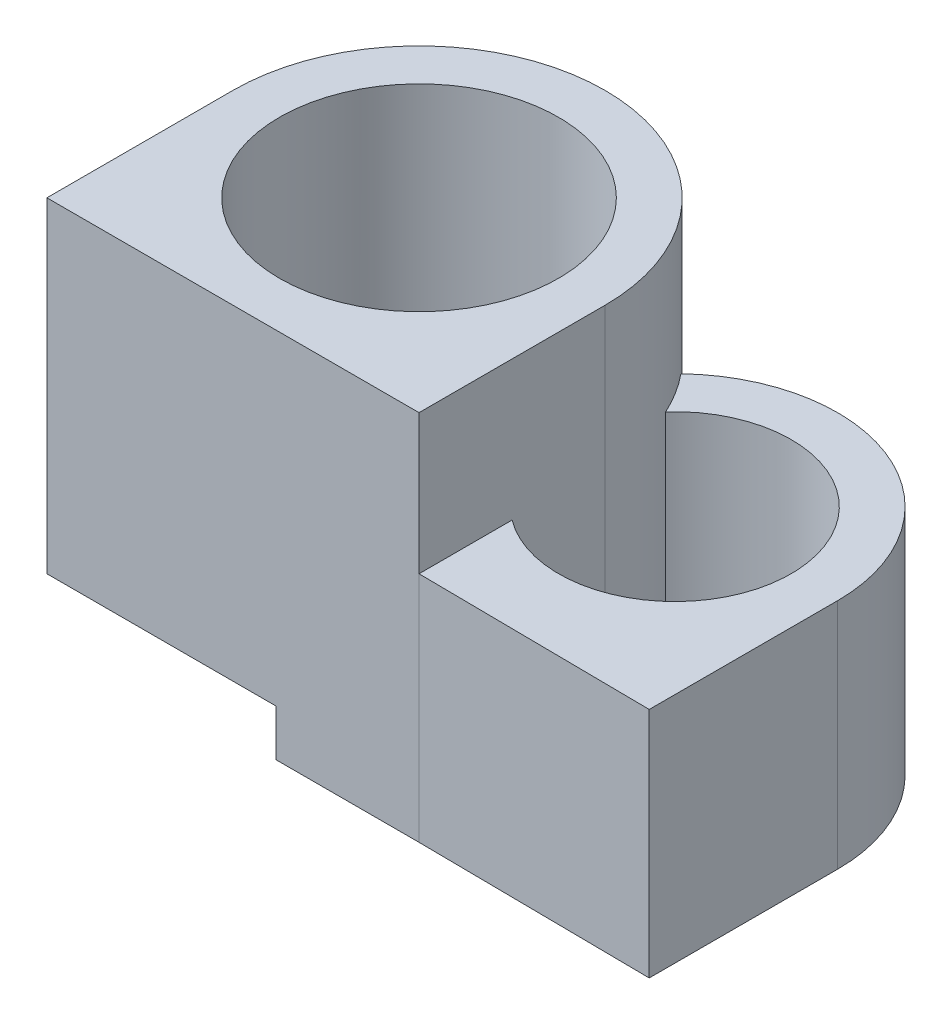
ISO-10303-21;
HEADER;
FILE_DESCRIPTION(('STEP AP214'),'2;1');
FILE_NAME('part.step','',(''),(''),'','','');
FILE_SCHEMA(('AUTOMOTIVE_DESIGN { 1 0 10303 214 1 1 1 1 }'));
ENDSEC;
DATA;
#1=APPLICATION_CONTEXT('core data for automotive mechanical design processes');
#2=APPLICATION_PROTOCOL_DEFINITION('international standard','automotive_design',2000,#1);
#3=PRODUCT_CONTEXT('',#1,'mechanical');
#4=PRODUCT('Part','Part','',(#3));
#5=PRODUCT_RELATED_PRODUCT_CATEGORY('part','',(#4));
#6=PRODUCT_DEFINITION_FORMATION('','',#4);
#7=PRODUCT_DEFINITION_CONTEXT('part definition',#1,'design');
#8=PRODUCT_DEFINITION('design','',#6,#7);
#9=PRODUCT_DEFINITION_SHAPE('','',#8);
#10=(LENGTH_UNIT() NAMED_UNIT(*) SI_UNIT(.MILLI.,.METRE.));
#11=(NAMED_UNIT(*) PLANE_ANGLE_UNIT() SI_UNIT($,.RADIAN.));
#12=(NAMED_UNIT(*) SI_UNIT($,.STERADIAN.) SOLID_ANGLE_UNIT());
#13=UNCERTAINTY_MEASURE_WITH_UNIT(LENGTH_MEASURE(1.E-05),#10,'distance_accuracy_value','');
#14=(GEOMETRIC_REPRESENTATION_CONTEXT(3) GLOBAL_UNCERTAINTY_ASSIGNED_CONTEXT((#13)) GLOBAL_UNIT_ASSIGNED_CONTEXT((#10,
#11,#12)) REPRESENTATION_CONTEXT('',''));
#15=CARTESIAN_POINT('',(0.,0.,0.));
#16=DIRECTION('',(0.,0.,1.));
#17=DIRECTION('',(1.,0.,0.));
#18=AXIS2_PLACEMENT_3D('',#15,#16,#17);
#19=CARTESIAN_POINT('',(0.,0.,0.));
#20=DIRECTION('',(0.,1.,0.));
#21=DIRECTION('',(0.,0.,1.));
#22=AXIS2_PLACEMENT_3D('',#19,#20,#21);
#23=PLANE('',#22);
#24=CARTESIAN_POINT('',(5.5,0.,0.));
#25=DIRECTION('',(0.,1.,0.));
#26=DIRECTION('',(0.,0.,1.));
#27=AXIS2_PLACEMENT_3D('',#24,#25,#26);
#28=CIRCLE('',#27,2.5);
#29=CARTESIAN_POINT('',(3.63636363636364,0.,-1.66639116180212));
#30=VERTEX_POINT('',#29);
#31=CARTESIAN_POINT('',(3.20908262871858,0.,-1.00084843905609));
#32=VERTEX_POINT('',#31);
#33=EDGE_CURVE('E203',#30,#32,#28,.T.);
#34=ORIENTED_EDGE('',*,*,#33,.F.);
#35=CARTESIAN_POINT('',(0.,0.,0.));
#36=DIRECTION('',(0.,1.,0.));
#37=DIRECTION('',(0.,0.,1.));
#38=AXIS2_PLACEMENT_3D('',#35,#36,#37);
#39=CIRCLE('',#38,4.);
#40=CARTESIAN_POINT('',(4.,0.,0.));
#41=VERTEX_POINT('',#40);
#42=EDGE_CURVE('E252',#41,#30,#39,.T.);
#43=ORIENTED_EDGE('',*,*,#42,.F.);
#44=DIRECTION('',(-0.620017940558597,0.,-0.7845876326998));
#45=VECTOR('',#44,1.);
#46=CARTESIAN_POINT('',(2.4623110135419,0.,-1.9458336328571));
#47=LINE('',#46,#45);
#48=EDGE_CURVE('E220',#41,#32,#47,.T.);
#49=ORIENTED_EDGE('',*,*,#48,.T.);
#50=EDGE_LOOP('',(#34,#43,#49));
#51=FACE_BOUND('',#50,.T.);
#52=ADVANCED_FACE('F39',(#51),#23,.F.);
#53=CARTESIAN_POINT('',(4.,7.,0.));
#54=DIRECTION('',(-1.,0.,0.));
#55=DIRECTION('',(0.,0.,1.));
#56=AXIS2_PLACEMENT_3D('',#53,#54,#55);
#57=PLANE('',#56);
#58=DIRECTION('',(0.,-1.,0.));
#59=VECTOR('',#58,1.);
#60=CARTESIAN_POINT('',(4.,4.,2.));
#61=LINE('',#60,#59);
#62=CARTESIAN_POINT('',(4.,4.,2.));
#63=VERTEX_POINT('',#62);
#64=CARTESIAN_POINT('',(4.,-1.,2.));
#65=VERTEX_POINT('',#64);
#66=EDGE_CURVE('E190',#63,#65,#61,.T.);
#67=ORIENTED_EDGE('',*,*,#66,.T.);
#68=DIRECTION('',(0.,0.,1.));
#69=VECTOR('',#68,1.);
#70=CARTESIAN_POINT('',(4.,-1.,0.));
#71=LINE('',#70,#69);
#72=CARTESIAN_POINT('',(4.,-1.,0.));
#73=VERTEX_POINT('',#72);
#74=EDGE_CURVE('E209',#73,#65,#71,.T.);
#75=ORIENTED_EDGE('',*,*,#74,.F.);
#76=DIRECTION('',(0.,1.,0.));
#77=VECTOR('',#76,1.);
#78=CARTESIAN_POINT('',(4.,-1.,0.));
#79=LINE('',#78,#77);
#80=EDGE_CURVE('E239',#73,#41,#79,.T.);
#81=ORIENTED_EDGE('',*,*,#80,.T.);
#82=DIRECTION('',(0.,-1.,0.));
#83=VECTOR('',#82,1.);
#84=CARTESIAN_POINT('',(4.,7.,0.));
#85=LINE('',#84,#83);
#86=CARTESIAN_POINT('',(4.,7.,0.));
#87=VERTEX_POINT('',#86);
#88=EDGE_CURVE('E269',#87,#41,#85,.T.);
#89=ORIENTED_EDGE('',*,*,#88,.F.);
#90=DIRECTION('',(0.,0.,-1.));
#91=VECTOR('',#90,1.);
#92=CARTESIAN_POINT('',(4.,7.,0.));
#93=LINE('',#92,#91);
#94=CARTESIAN_POINT('',(4.,7.,4.));
#95=VERTEX_POINT('',#94);
#96=EDGE_CURVE('E254',#95,#87,#93,.T.);
#97=ORIENTED_EDGE('',*,*,#96,.F.);
#98=DIRECTION('',(0.,-1.,0.));
#99=VECTOR('',#98,1.);
#100=CARTESIAN_POINT('',(4.,7.,4.));
#101=LINE('',#100,#99);
#102=CARTESIAN_POINT('',(4.,4.,4.));
#103=VERTEX_POINT('',#102);
#104=EDGE_CURVE('E271',#95,#103,#101,.T.);
#105=ORIENTED_EDGE('',*,*,#104,.T.);
#106=DIRECTION('',(0.,0.,1.));
#107=VECTOR('',#106,1.);
#108=CARTESIAN_POINT('',(4.,4.,0.));
#109=LINE('',#108,#107);
#110=EDGE_CURVE('E175',#63,#103,#109,.T.);
#111=ORIENTED_EDGE('',*,*,#110,.F.);
#112=EDGE_LOOP('',(#67,#75,#81,#89,#97,#105,#111));
#113=FACE_BOUND('',#112,.T.);
#114=ADVANCED_FACE('F307',(#113),#57,.F.);
#115=CARTESIAN_POINT('',(0.,7.,0.));
#116=DIRECTION('',(0.,-1.,0.));
#117=DIRECTION('',(0.,0.,-1.));
#118=AXIS2_PLACEMENT_3D('',#115,#116,#117);
#119=CYLINDRICAL_SURFACE('',#118,4.);
#120=DIRECTION('',(0.,-1.,0.));
#121=VECTOR('',#120,1.);
#122=CARTESIAN_POINT('',(3.63636363636364,2.,-1.66639116180212));
#123=LINE('',#122,#121);
#124=CARTESIAN_POINT('',(3.63636363636364,4.,-1.66639116180212));
#125=VERTEX_POINT('',#124);
#126=EDGE_CURVE('E54',#125,#30,#123,.T.);
#127=ORIENTED_EDGE('',*,*,#126,.F.);
#128=CARTESIAN_POINT('',(0.,4.,0.));
#129=DIRECTION('',(0.,-1.,0.));
#130=DIRECTION('',(0.,0.,-1.));
#131=AXIS2_PLACEMENT_3D('',#128,#129,#130);
#132=CIRCLE('',#131,4.);
#133=CARTESIAN_POINT('',(3.09090909090909,4.,-2.53895273523072));
#134=VERTEX_POINT('',#133);
#135=EDGE_CURVE('E11',#134,#125,#132,.T.);
#136=ORIENTED_EDGE('',*,*,#135,.F.);
#137=DIRECTION('',(0.,-1.,0.));
#138=VECTOR('',#137,1.);
#139=CARTESIAN_POINT('',(3.09090909090909,1.5,-2.53895273523072));
#140=LINE('',#139,#138);
#141=CARTESIAN_POINT('',(3.09090909090909,0.,-2.53895273523072));
#142=VERTEX_POINT('',#141);
#143=EDGE_CURVE('E155',#134,#142,#140,.T.);
#144=ORIENTED_EDGE('',*,*,#143,.T.);
#145=CARTESIAN_POINT('',(0.924622027083809,0.,-3.8916672657142));
#146=VERTEX_POINT('',#145);
#147=EDGE_CURVE('E266',#142,#146,#39,.T.);
#148=ORIENTED_EDGE('',*,*,#147,.T.);
#149=CARTESIAN_POINT('',(-4.,0.,0.));
#150=VERTEX_POINT('',#149);
#151=EDGE_CURVE('E264',#146,#150,#39,.T.);
#152=ORIENTED_EDGE('',*,*,#151,.T.);
#153=DIRECTION('',(0.,-1.,0.));
#154=VECTOR('',#153,1.);
#155=CARTESIAN_POINT('',(-4.,7.,0.));
#156=LINE('',#155,#154);
#157=CARTESIAN_POINT('',(-4.,7.,0.));
#158=VERTEX_POINT('',#157);
#159=EDGE_CURVE('E258',#158,#150,#156,.T.);
#160=ORIENTED_EDGE('',*,*,#159,.F.);
#161=CARTESIAN_POINT('',(0.,7.,0.));
#162=DIRECTION('',(0.,1.,0.));
#163=DIRECTION('',(0.,0.,1.));
#164=AXIS2_PLACEMENT_3D('',#161,#162,#163);
#165=CIRCLE('',#164,4.);
#166=EDGE_CURVE('E256',#87,#158,#165,.T.);
#167=ORIENTED_EDGE('',*,*,#166,.F.);
#168=ORIENTED_EDGE('',*,*,#88,.T.);
#169=ORIENTED_EDGE('',*,*,#42,.T.);
#170=EDGE_LOOP('',(#127,#136,#144,#148,#152,#160,#167,#168,#169));
#171=FACE_BOUND('',#170,.T.);
#172=ADVANCED_FACE('F313',(#171),#119,.T.);
#173=CARTESIAN_POINT('',(2.4623110135419,-1.,-1.9458336328571));
#174=DIRECTION('',(0.7845876326998,0.,-0.620017940558597));
#175=DIRECTION('',(-0.620017940558597,0.,-0.7845876326998));
#176=AXIS2_PLACEMENT_3D('',#173,#174,#175);
#177=PLANE('',#176);
#178=DIRECTION('',(-0.620017940558597,0.,-0.7845876326998));
#179=VECTOR('',#178,1.);
#180=CARTESIAN_POINT('',(2.4623110135419,-1.,-1.9458336328571));
#181=LINE('',#180,#179);
#182=CARTESIAN_POINT('',(3.20908262871858,-1.,-1.00084843905609));
#183=VERTEX_POINT('',#182);
#184=EDGE_CURVE('E207',#73,#183,#181,.T.);
#185=ORIENTED_EDGE('',*,*,#184,.T.);
#186=DIRECTION('',(0.,-1.,0.));
#187=VECTOR('',#186,1.);
#188=CARTESIAN_POINT('',(3.20908262871858,4.,-1.00084843905609));
#189=LINE('',#188,#187);
#190=EDGE_CURVE('E187',#32,#183,#189,.T.);
#191=ORIENTED_EDGE('',*,*,#190,.F.);
#192=ORIENTED_EDGE('',*,*,#48,.F.);
#193=ORIENTED_EDGE('',*,*,#80,.F.);
#194=EDGE_LOOP('',(#185,#191,#192,#193));
#195=FACE_BOUND('',#194,.T.);
#196=ADVANCED_FACE('F345',(#195),#177,.T.);
#197=DIRECTION('',(0.,0.,-1.));
#198=VECTOR('',#197,1.);
#199=CARTESIAN_POINT('',(0.924622027083809,0.,0.));
#200=LINE('',#199,#198);
#201=CARTESIAN_POINT('',(0.924622027083809,0.,-2.8539576218002));
#202=VERTEX_POINT('',#201);
#203=EDGE_CURVE('E226',#202,#146,#200,.T.);
#204=ORIENTED_EDGE('',*,*,#203,.F.);
#205=CARTESIAN_POINT('',(0.,0.,0.));
#206=DIRECTION('',(0.,1.,0.));
#207=DIRECTION('',(0.,0.,1.));
#208=AXIS2_PLACEMENT_3D('',#205,#206,#207);
#209=CIRCLE('',#208,3.);
#210=CARTESIAN_POINT('',(0.924622027083809,0.,2.8539576218002));
#211=VERTEX_POINT('',#210);
#212=EDGE_CURVE('E242',#202,#211,#209,.T.);
#213=ORIENTED_EDGE('',*,*,#212,.T.);
#214=CARTESIAN_POINT('',(0.924622027083809,0.,4.));
#215=VERTEX_POINT('',#214);
#216=EDGE_CURVE('E223',#215,#211,#200,.T.);
#217=ORIENTED_EDGE('',*,*,#216,.F.);
#218=DIRECTION('',(1.,0.,0.));
#219=VECTOR('',#218,1.);
#220=CARTESIAN_POINT('',(4.,0.,4.));
#221=LINE('',#220,#219);
#222=CARTESIAN_POINT('',(-4.,0.,4.));
#223=VERTEX_POINT('',#222);
#224=EDGE_CURVE('E261',#223,#215,#221,.T.);
#225=ORIENTED_EDGE('',*,*,#224,.F.);
#226=DIRECTION('',(0.,0.,1.));
#227=VECTOR('',#226,1.);
#228=CARTESIAN_POINT('',(-4.,0.,4.));
#229=LINE('',#228,#227);
#230=EDGE_CURVE('E246',#150,#223,#229,.T.);
#231=ORIENTED_EDGE('',*,*,#230,.F.);
#232=ORIENTED_EDGE('',*,*,#151,.F.);
#233=EDGE_LOOP('',(#204,#213,#217,#225,#231,#232));
#234=FACE_BOUND('',#233,.T.);
#235=ADVANCED_FACE('F285',(#234),#23,.F.);
#236=CARTESIAN_POINT('',(0.,7.,0.));
#237=DIRECTION('',(0.,1.,0.));
#238=DIRECTION('',(0.,0.,1.));
#239=AXIS2_PLACEMENT_3D('',#236,#237,#238);
#240=PLANE('',#239);
#241=DIRECTION('',(0.,0.,1.));
#242=VECTOR('',#241,1.);
#243=CARTESIAN_POINT('',(-4.,7.,4.));
#244=LINE('',#243,#242);
#245=CARTESIAN_POINT('',(-4.,7.,4.));
#246=VERTEX_POINT('',#245);
#247=EDGE_CURVE('E248',#158,#246,#244,.T.);
#248=ORIENTED_EDGE('',*,*,#247,.T.);
#249=DIRECTION('',(1.,0.,0.));
#250=VECTOR('',#249,1.);
#251=CARTESIAN_POINT('',(4.,7.,4.));
#252=LINE('',#251,#250);
#253=EDGE_CURVE('E251',#246,#95,#252,.T.);
#254=ORIENTED_EDGE('',*,*,#253,.T.);
#255=ORIENTED_EDGE('',*,*,#96,.T.);
#256=ORIENTED_EDGE('',*,*,#166,.T.);
#257=EDGE_LOOP('',(#248,#254,#255,#256));
#258=FACE_BOUND('',#257,.T.);
#259=CARTESIAN_POINT('',(0.,7.,0.));
#260=DIRECTION('',(0.,1.,0.));
#261=DIRECTION('',(0.,0.,1.));
#262=AXIS2_PLACEMENT_3D('',#259,#260,#261);
#263=CIRCLE('',#262,3.);
#264=CARTESIAN_POINT('',(0.,7.,3.));
#265=VERTEX_POINT('',#264);
#266=EDGE_CURVE('E243',#265,#265,#263,.T.);
#267=ORIENTED_EDGE('',*,*,#266,.F.);
#268=EDGE_LOOP('',(#267));
#269=FACE_BOUND('',#268,.T.);
#270=ADVANCED_FACE('F311',(#258,#269),#240,.T.);
#271=ORIENTED_EDGE('',*,*,#147,.F.);
#272=CARTESIAN_POINT('',(5.5,0.,0.));
#273=DIRECTION('',(0.,1.,0.));
#274=DIRECTION('',(0.,0.,1.));
#275=AXIS2_PLACEMENT_3D('',#272,#273,#274);
#276=CIRCLE('',#275,3.5);
#277=CARTESIAN_POINT('',(2.53292876566691,0.,-1.85647200097203));
#278=VERTEX_POINT('',#277);
#279=EDGE_CURVE('E200',#142,#278,#276,.T.);
#280=ORIENTED_EDGE('',*,*,#279,.T.);
#281=EDGE_CURVE('E206',#278,#146,#47,.T.);
#282=ORIENTED_EDGE('',*,*,#281,.T.);
#283=EDGE_LOOP('',(#271,#280,#282));
#284=FACE_BOUND('',#283,.T.);
#285=ADVANCED_FACE('F318',(#284),#23,.F.);
#286=CARTESIAN_POINT('',(-4.,7.,4.));
#287=DIRECTION('',(1.,0.,0.));
#288=DIRECTION('',(0.,0.,-1.));
#289=AXIS2_PLACEMENT_3D('',#286,#287,#288);
#290=PLANE('',#289);
#291=ORIENTED_EDGE('',*,*,#230,.T.);
#292=DIRECTION('',(0.,-1.,0.));
#293=VECTOR('',#292,1.);
#294=CARTESIAN_POINT('',(-4.,7.,4.));
#295=LINE('',#294,#293);
#296=EDGE_CURVE('E47',#246,#223,#295,.T.);
#297=ORIENTED_EDGE('',*,*,#296,.F.);
#298=ORIENTED_EDGE('',*,*,#247,.F.);
#299=ORIENTED_EDGE('',*,*,#159,.T.);
#300=EDGE_LOOP('',(#291,#297,#298,#299));
#301=FACE_BOUND('',#300,.T.);
#302=ADVANCED_FACE('F41',(#301),#290,.F.);
#303=CARTESIAN_POINT('',(4.,7.,4.));
#304=DIRECTION('',(0.,0.,-1.));
#305=DIRECTION('',(-1.,0.,0.));
#306=AXIS2_PLACEMENT_3D('',#303,#304,#305);
#307=PLANE('',#306);
#308=ORIENTED_EDGE('',*,*,#224,.T.);
#309=DIRECTION('',(0.,1.,0.));
#310=VECTOR('',#309,1.);
#311=CARTESIAN_POINT('',(0.924622027083809,-1.,4.));
#312=LINE('',#311,#310);
#313=CARTESIAN_POINT('',(0.924622027083809,-1.,4.));
#314=VERTEX_POINT('',#313);
#315=EDGE_CURVE('E236',#314,#215,#312,.T.);
#316=ORIENTED_EDGE('',*,*,#315,.F.);
#317=DIRECTION('',(-1.,0.,0.));
#318=VECTOR('',#317,1.);
#319=CARTESIAN_POINT('',(0.,-1.,4.));
#320=LINE('',#319,#318);
#321=CARTESIAN_POINT('',(4.,-1.,4.));
#322=VERTEX_POINT('',#321);
#323=EDGE_CURVE('E213',#322,#314,#320,.T.);
#324=ORIENTED_EDGE('',*,*,#323,.F.);
#325=DIRECTION('',(0.,-1.,0.));
#326=VECTOR('',#325,1.);
#327=CARTESIAN_POINT('',(4.,4.,4.));
#328=LINE('',#327,#326);
#329=EDGE_CURVE('E193',#103,#322,#328,.T.);
#330=ORIENTED_EDGE('',*,*,#329,.F.);
#331=ORIENTED_EDGE('',*,*,#104,.F.);
#332=ORIENTED_EDGE('',*,*,#253,.F.);
#333=ORIENTED_EDGE('',*,*,#296,.T.);
#334=EDGE_LOOP('',(#308,#316,#324,#330,#331,#332,#333));
#335=FACE_BOUND('',#334,.T.);
#336=ADVANCED_FACE('F276',(#335),#307,.F.);
#337=CARTESIAN_POINT('',(0.,7.,0.));
#338=DIRECTION('',(0.,-1.,0.));
#339=DIRECTION('',(0.,0.,-1.));
#340=AXIS2_PLACEMENT_3D('',#337,#338,#339);
#341=CYLINDRICAL_SURFACE('',#340,3.);
#342=ORIENTED_EDGE('',*,*,#266,.T.);
#343=EDGE_LOOP('',(#342));
#344=FACE_BOUND('',#343,.T.);
#345=ORIENTED_EDGE('',*,*,#212,.F.);
#346=DIRECTION('',(0.,1.,0.));
#347=VECTOR('',#346,1.);
#348=CARTESIAN_POINT('',(0.924622027083809,-1.,-2.8539576218002));
#349=LINE('',#348,#347);
#350=CARTESIAN_POINT('',(0.924622027083809,-1.,-2.8539576218002));
#351=VERTEX_POINT('',#350);
#352=EDGE_CURVE('E230',#351,#202,#349,.T.);
#353=ORIENTED_EDGE('',*,*,#352,.F.);
#354=CARTESIAN_POINT('',(0.,-1.,0.));
#355=DIRECTION('',(0.,-1.,0.));
#356=DIRECTION('',(0.,0.,-1.));
#357=AXIS2_PLACEMENT_3D('',#354,#355,#356);
#358=CIRCLE('',#357,3.);
#359=CARTESIAN_POINT('',(0.924622027083809,-1.,2.8539576218002));
#360=VERTEX_POINT('',#359);
#361=EDGE_CURVE('E217',#360,#351,#358,.F.);
#362=ORIENTED_EDGE('',*,*,#361,.F.);
#363=DIRECTION('',(0.,1.,0.));
#364=VECTOR('',#363,1.);
#365=CARTESIAN_POINT('',(0.924622027083809,-1.,2.8539576218002));
#366=LINE('',#365,#364);
#367=EDGE_CURVE('E233',#360,#211,#366,.T.);
#368=ORIENTED_EDGE('',*,*,#367,.T.);
#369=EDGE_LOOP('',(#345,#353,#362,#368));
#370=FACE_BOUND('',#369,.T.);
#371=ADVANCED_FACE('F293',(#344,#370),#341,.F.);
#372=DIRECTION('',(0.,-1.,0.));
#373=VECTOR('',#372,1.);
#374=CARTESIAN_POINT('',(2.53292876566691,4.,-1.85647200097203));
#375=LINE('',#374,#373);
#376=CARTESIAN_POINT('',(2.53292876566691,-1.,-1.85647200097203));
#377=VERTEX_POINT('',#376);
#378=EDGE_CURVE('E168',#278,#377,#375,.T.);
#379=ORIENTED_EDGE('',*,*,#378,.T.);
#380=CARTESIAN_POINT('',(0.924622027083809,-1.,-3.8916672657142));
#381=VERTEX_POINT('',#380);
#382=EDGE_CURVE('E210',#377,#381,#181,.T.);
#383=ORIENTED_EDGE('',*,*,#382,.T.);
#384=DIRECTION('',(0.,1.,0.));
#385=VECTOR('',#384,1.);
#386=CARTESIAN_POINT('',(0.924622027083809,-1.,-3.8916672657142));
#387=LINE('',#386,#385);
#388=EDGE_CURVE('E227',#381,#146,#387,.T.);
#389=ORIENTED_EDGE('',*,*,#388,.T.);
#390=ORIENTED_EDGE('',*,*,#281,.F.);
#391=EDGE_LOOP('',(#379,#383,#389,#390));
#392=FACE_BOUND('',#391,.T.);
#393=ADVANCED_FACE('F321',(#392),#177,.T.);
#394=CARTESIAN_POINT('',(0.924622027083809,-1.,0.));
#395=DIRECTION('',(1.,0.,0.));
#396=DIRECTION('',(0.,0.,-1.));
#397=AXIS2_PLACEMENT_3D('',#394,#395,#396);
#398=PLANE('',#397);
#399=ORIENTED_EDGE('',*,*,#216,.T.);
#400=ORIENTED_EDGE('',*,*,#367,.F.);
#401=DIRECTION('',(0.,0.,-1.));
#402=VECTOR('',#401,1.);
#403=CARTESIAN_POINT('',(0.924622027083809,-1.,0.));
#404=LINE('',#403,#402);
#405=EDGE_CURVE('E215',#314,#360,#404,.T.);
#406=ORIENTED_EDGE('',*,*,#405,.F.);
#407=ORIENTED_EDGE('',*,*,#315,.T.);
#408=EDGE_LOOP('',(#399,#400,#406,#407));
#409=FACE_BOUND('',#408,.T.);
#410=ADVANCED_FACE('F289',(#409),#398,.F.);
#411=ORIENTED_EDGE('',*,*,#203,.T.);
#412=ORIENTED_EDGE('',*,*,#388,.F.);
#413=EDGE_CURVE('E218',#351,#381,#404,.T.);
#414=ORIENTED_EDGE('',*,*,#413,.F.);
#415=ORIENTED_EDGE('',*,*,#352,.T.);
#416=EDGE_LOOP('',(#411,#412,#414,#415));
#417=FACE_BOUND('',#416,.T.);
#418=ADVANCED_FACE('F324',(#417),#398,.F.);
#419=CARTESIAN_POINT('',(0.,-1.,0.));
#420=DIRECTION('',(0.,-1.,0.));
#421=DIRECTION('',(0.,0.,-1.));
#422=AXIS2_PLACEMENT_3D('',#419,#420,#421);
#423=PLANE('',#422);
#424=CARTESIAN_POINT('',(5.5,-1.,0.));
#425=DIRECTION('',(0.,-1.,0.));
#426=DIRECTION('',(0.,0.,-1.));
#427=AXIS2_PLACEMENT_3D('',#424,#425,#426);
#428=CIRCLE('',#427,2.5);
#429=EDGE_CURVE('E159',#183,#65,#428,.T.);
#430=ORIENTED_EDGE('',*,*,#429,.F.);
#431=ORIENTED_EDGE('',*,*,#184,.F.);
#432=ORIENTED_EDGE('',*,*,#74,.T.);
#433=EDGE_LOOP('',(#430,#431,#432));
#434=FACE_BOUND('',#433,.T.);
#435=ORIENTED_EDGE('',*,*,#382,.F.);
#436=CARTESIAN_POINT('',(5.5,-1.,0.));
#437=DIRECTION('',(0.,-1.,0.));
#438=DIRECTION('',(0.,0.,-1.));
#439=AXIS2_PLACEMENT_3D('',#436,#437,#438);
#440=CIRCLE('',#439,3.5);
#441=CARTESIAN_POINT('',(9.,-1.,0.));
#442=VERTEX_POINT('',#441);
#443=EDGE_CURVE('E181',#377,#442,#440,.T.);
#444=ORIENTED_EDGE('',*,*,#443,.T.);
#445=DIRECTION('',(0.,0.,1.));
#446=VECTOR('',#445,1.);
#447=CARTESIAN_POINT('',(9.,-1.,0.));
#448=LINE('',#447,#446);
#449=CARTESIAN_POINT('',(9.,-1.,4.05149362124009));
#450=VERTEX_POINT('',#449);
#451=EDGE_CURVE('E165',#442,#450,#448,.T.);
#452=ORIENTED_EDGE('',*,*,#451,.T.);
#453=DIRECTION('',(-0.999946972357626,0.,-0.0102981781309526));
#454=VECTOR('',#453,1.);
#455=CARTESIAN_POINT('',(-0.0407663182801149,-1.,3.95838526193735));
#456=LINE('',#455,#454);
#457=EDGE_CURVE('E184',#450,#322,#456,.T.);
#458=ORIENTED_EDGE('',*,*,#457,.T.);
#459=ORIENTED_EDGE('',*,*,#323,.T.);
#460=ORIENTED_EDGE('',*,*,#405,.T.);
#461=ORIENTED_EDGE('',*,*,#361,.T.);
#462=ORIENTED_EDGE('',*,*,#413,.T.);
#463=EDGE_LOOP('',(#435,#444,#452,#458,#459,#460,#461,#462));
#464=FACE_BOUND('',#463,.T.);
#465=ADVANCED_FACE('F298',(#434,#464),#423,.T.);
#466=CARTESIAN_POINT('',(5.5,4.,0.));
#467=DIRECTION('',(0.,-1.,0.));
#468=DIRECTION('',(0.,0.,-1.));
#469=AXIS2_PLACEMENT_3D('',#466,#467,#468);
#470=CYLINDRICAL_SURFACE('',#469,2.5);
#471=ORIENTED_EDGE('',*,*,#126,.T.);
#472=ORIENTED_EDGE('',*,*,#33,.T.);
#473=ORIENTED_EDGE('',*,*,#190,.T.);
#474=ORIENTED_EDGE('',*,*,#429,.T.);
#475=ORIENTED_EDGE('',*,*,#66,.F.);
#476=CARTESIAN_POINT('',(5.5,4.,0.));
#477=DIRECTION('',(0.,-1.,0.));
#478=DIRECTION('',(0.,0.,-1.));
#479=AXIS2_PLACEMENT_3D('',#476,#477,#478);
#480=CIRCLE('',#479,2.5);
#481=EDGE_CURVE('E179',#125,#63,#480,.T.);
#482=ORIENTED_EDGE('',*,*,#481,.F.);
#483=EDGE_LOOP('',(#471,#472,#473,#474,#475,#482));
#484=FACE_BOUND('',#483,.T.);
#485=ADVANCED_FACE('F331',(#484),#470,.F.);
#486=CARTESIAN_POINT('',(5.5,4.,0.));
#487=DIRECTION('',(0.,-1.,0.));
#488=DIRECTION('',(0.,0.,-1.));
#489=AXIS2_PLACEMENT_3D('',#486,#487,#488);
#490=CYLINDRICAL_SURFACE('',#489,3.5);
#491=ORIENTED_EDGE('',*,*,#279,.F.);
#492=ORIENTED_EDGE('',*,*,#143,.F.);
#493=CARTESIAN_POINT('',(5.5,4.,0.));
#494=DIRECTION('',(0.,-1.,0.));
#495=DIRECTION('',(0.,0.,-1.));
#496=AXIS2_PLACEMENT_3D('',#493,#494,#495);
#497=CIRCLE('',#496,3.5);
#498=CARTESIAN_POINT('',(9.,4.,0.));
#499=VERTEX_POINT('',#498);
#500=EDGE_CURVE('E148',#134,#499,#497,.T.);
#501=ORIENTED_EDGE('',*,*,#500,.T.);
#502=DIRECTION('',(0.,-1.,0.));
#503=VECTOR('',#502,1.);
#504=CARTESIAN_POINT('',(9.,4.,0.));
#505=LINE('',#504,#503);
#506=EDGE_CURVE('E153',#499,#442,#505,.T.);
#507=ORIENTED_EDGE('',*,*,#506,.T.);
#508=ORIENTED_EDGE('',*,*,#443,.F.);
#509=ORIENTED_EDGE('',*,*,#378,.F.);
#510=EDGE_LOOP('',(#491,#492,#501,#507,#508,#509));
#511=FACE_BOUND('',#510,.T.);
#512=ADVANCED_FACE('F151',(#511),#490,.T.);
#513=CARTESIAN_POINT('',(-0.0407663182801149,4.,3.95838526193735));
#514=DIRECTION('',(-0.0102981781309526,0.,0.999946972357626));
#515=DIRECTION('',(0.999946972357626,0.,0.0102981781309526));
#516=AXIS2_PLACEMENT_3D('',#513,#514,#515);
#517=PLANE('',#516);
#518=ORIENTED_EDGE('',*,*,#457,.F.);
#519=DIRECTION('',(0.,-1.,0.));
#520=VECTOR('',#519,1.);
#521=CARTESIAN_POINT('',(9.,4.,4.05149362124009));
#522=LINE('',#521,#520);
#523=CARTESIAN_POINT('',(9.,4.,4.05149362124009));
#524=VERTEX_POINT('',#523);
#525=EDGE_CURVE('E167',#524,#450,#522,.T.);
#526=ORIENTED_EDGE('',*,*,#525,.F.);
#527=DIRECTION('',(-0.999946972357626,0.,-0.0102981781309526));
#528=VECTOR('',#527,1.);
#529=CARTESIAN_POINT('',(-0.0407663182801149,4.,3.95838526193735));
#530=LINE('',#529,#528);
#531=EDGE_CURVE('E173',#524,#103,#530,.T.);
#532=ORIENTED_EDGE('',*,*,#531,.T.);
#533=ORIENTED_EDGE('',*,*,#329,.T.);
#534=EDGE_LOOP('',(#518,#526,#532,#533));
#535=FACE_BOUND('',#534,.T.);
#536=ADVANCED_FACE('F371',(#535),#517,.T.);
#537=CARTESIAN_POINT('',(9.,4.,0.));
#538=DIRECTION('',(1.,0.,0.));
#539=DIRECTION('',(0.,0.,-1.));
#540=AXIS2_PLACEMENT_3D('',#537,#538,#539);
#541=PLANE('',#540);
#542=ORIENTED_EDGE('',*,*,#451,.F.);
#543=ORIENTED_EDGE('',*,*,#506,.F.);
#544=DIRECTION('',(0.,0.,1.));
#545=VECTOR('',#544,1.);
#546=CARTESIAN_POINT('',(9.,4.,0.));
#547=LINE('',#546,#545);
#548=EDGE_CURVE('E158',#499,#524,#547,.T.);
#549=ORIENTED_EDGE('',*,*,#548,.T.);
#550=ORIENTED_EDGE('',*,*,#525,.T.);
#551=EDGE_LOOP('',(#542,#543,#549,#550));
#552=FACE_BOUND('',#551,.T.);
#553=ADVANCED_FACE('F163',(#552),#541,.T.);
#554=CARTESIAN_POINT('',(0.,4.,0.));
#555=DIRECTION('',(0.,-1.,0.));
#556=DIRECTION('',(0.,0.,-1.));
#557=AXIS2_PLACEMENT_3D('',#554,#555,#556);
#558=PLANE('',#557);
#559=ORIENTED_EDGE('',*,*,#500,.F.);
#560=ORIENTED_EDGE('',*,*,#135,.T.);
#561=ORIENTED_EDGE('',*,*,#481,.T.);
#562=ORIENTED_EDGE('',*,*,#110,.T.);
#563=ORIENTED_EDGE('',*,*,#531,.F.);
#564=ORIENTED_EDGE('',*,*,#548,.F.);
#565=EDGE_LOOP('',(#559,#560,#561,#562,#563,#564));
#566=FACE_BOUND('',#565,.T.);
#567=ADVANCED_FACE('F171',(#566),#558,.F.);
#568=CLOSED_SHELL('',(#52,#114,#172,#196,#235,#270,#285,#302,#336,#371,#393,#410,#418,#465,#485,
#512,#536,#553,#567));
#569=MANIFOLD_SOLID_BREP('B2',#568);
#570=ADVANCED_BREP_SHAPE_REPRESENTATION('',(#18,#569),#14);
#571=SHAPE_DEFINITION_REPRESENTATION(#9,#570);
ENDSEC;
END-ISO-10303-21;
